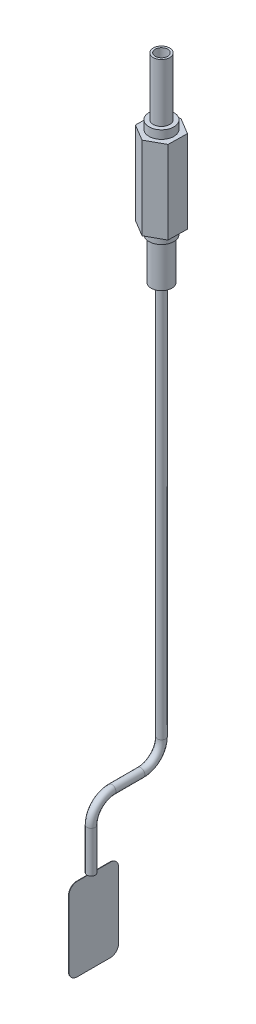
ISO-10303-21;
HEADER;
FILE_DESCRIPTION(('STEP AP214'),'2;1');
FILE_NAME('part.step','',(''),(''),'','','');
FILE_SCHEMA(('AUTOMOTIVE_DESIGN { 1 0 10303 214 1 1 1 1 }'));
ENDSEC;
DATA;
#1=APPLICATION_CONTEXT('core data for automotive mechanical design processes');
#2=APPLICATION_PROTOCOL_DEFINITION('international standard','automotive_design',2000,#1);
#3=PRODUCT_CONTEXT('',#1,'mechanical');
#4=PRODUCT('Part','Part','',(#3));
#5=PRODUCT_RELATED_PRODUCT_CATEGORY('part','',(#4));
#6=PRODUCT_DEFINITION_FORMATION('','',#4);
#7=PRODUCT_DEFINITION_CONTEXT('part definition',#1,'design');
#8=PRODUCT_DEFINITION('design','',#6,#7);
#9=PRODUCT_DEFINITION_SHAPE('','',#8);
#10=(LENGTH_UNIT() NAMED_UNIT(*) SI_UNIT(.MILLI.,.METRE.));
#11=(NAMED_UNIT(*) PLANE_ANGLE_UNIT() SI_UNIT($,.RADIAN.));
#12=(NAMED_UNIT(*) SI_UNIT($,.STERADIAN.) SOLID_ANGLE_UNIT());
#13=UNCERTAINTY_MEASURE_WITH_UNIT(LENGTH_MEASURE(1.E-05),#10,'distance_accuracy_value','');
#14=(GEOMETRIC_REPRESENTATION_CONTEXT(3) GLOBAL_UNCERTAINTY_ASSIGNED_CONTEXT((#13)) GLOBAL_UNIT_ASSIGNED_CONTEXT((#10,
#11,#12)) REPRESENTATION_CONTEXT('',''));
#15=CARTESIAN_POINT('',(0.,0.,0.));
#16=DIRECTION('',(0.,0.,1.));
#17=DIRECTION('',(1.,0.,0.));
#18=AXIS2_PLACEMENT_3D('',#15,#16,#17);
#19=CARTESIAN_POINT('',(0.,-115.,17.));
#20=DIRECTION('',(0.,-1.,0.));
#21=DIRECTION('',(0.,0.,-1.));
#22=AXIS2_PLACEMENT_3D('',#19,#20,#21);
#23=PLANE('',#22);
#24=CARTESIAN_POINT('',(0.,-115.,17.));
#25=DIRECTION('',(0.,-1.,0.));
#26=DIRECTION('',(0.,0.,-1.));
#27=AXIS2_PLACEMENT_3D('',#24,#25,#26);
#28=CIRCLE('',#27,1.);
#29=CARTESIAN_POINT('',(0.,-115.,18.));
#30=VERTEX_POINT('',#29);
#31=CARTESIAN_POINT('',(0.,-115.,16.));
#32=VERTEX_POINT('',#31);
#33=EDGE_CURVE('E205',#30,#32,#28,.T.);
#34=ORIENTED_EDGE('',*,*,#33,.T.);
#35=DIRECTION('',(0.,0.,1.));
#36=VECTOR('',#35,1.);
#37=CARTESIAN_POINT('',(0.,-115.,12.4412442422695));
#38=LINE('',#37,#36);
#39=EDGE_CURVE('E64',#32,#30,#38,.T.);
#40=ORIENTED_EDGE('',*,*,#39,.T.);
#41=EDGE_LOOP('',(#34,#40));
#42=FACE_BOUND('',#41,.T.);
#43=ADVANCED_FACE('F48',(#42),#23,.T.);
#44=CARTESIAN_POINT('',(0.,0.,0.));
#45=DIRECTION('',(0.,1.,0.));
#46=DIRECTION('',(0.,0.,1.));
#47=AXIS2_PLACEMENT_3D('',#44,#45,#46);
#48=PLANE('',#47);
#49=CARTESIAN_POINT('',(0.,0.,0.));
#50=DIRECTION('',(0.,1.,0.));
#51=DIRECTION('',(0.,0.,1.));
#52=AXIS2_PLACEMENT_3D('',#49,#50,#51);
#53=CIRCLE('',#52,2.5);
#54=CARTESIAN_POINT('',(0.,0.,2.5));
#55=VERTEX_POINT('',#54);
#56=EDGE_CURVE('E52',#55,#55,#53,.T.);
#57=ORIENTED_EDGE('',*,*,#56,.F.);
#58=EDGE_LOOP('',(#57));
#59=FACE_BOUND('',#58,.T.);
#60=CARTESIAN_POINT('',(0.,0.,0.));
#61=DIRECTION('',(0.,1.,0.));
#62=DIRECTION('',(0.,0.,1.));
#63=AXIS2_PLACEMENT_3D('',#60,#61,#62);
#64=CIRCLE('',#63,2.);
#65=CARTESIAN_POINT('',(0.,0.,2.));
#66=VERTEX_POINT('',#65);
#67=EDGE_CURVE('E281',#66,#66,#64,.T.);
#68=ORIENTED_EDGE('',*,*,#67,.T.);
#69=EDGE_LOOP('',(#68));
#70=FACE_BOUND('',#69,.T.);
#71=ADVANCED_FACE('F290',(#59,#70),#48,.F.);
#72=CARTESIAN_POINT('',(0.,10.,0.));
#73=DIRECTION('',(0.,-1.,0.));
#74=DIRECTION('',(0.,0.,-1.));
#75=AXIS2_PLACEMENT_3D('',#72,#73,#74);
#76=CYLINDRICAL_SURFACE('',#75,2.5);
#77=CARTESIAN_POINT('',(0.,10.,0.));
#78=DIRECTION('',(0.,1.,0.));
#79=DIRECTION('',(0.,0.,1.));
#80=AXIS2_PLACEMENT_3D('',#77,#78,#79);
#81=CIRCLE('',#80,2.5);
#82=CARTESIAN_POINT('',(0.,10.,2.5));
#83=VERTEX_POINT('',#82);
#84=EDGE_CURVE('E228',#83,#83,#81,.T.);
#85=ORIENTED_EDGE('',*,*,#84,.F.);
#86=EDGE_LOOP('',(#85));
#87=FACE_BOUND('',#86,.T.);
#88=ORIENTED_EDGE('',*,*,#56,.T.);
#89=EDGE_LOOP('',(#88));
#90=FACE_BOUND('',#89,.T.);
#91=ADVANCED_FACE('F50',(#87,#90),#76,.T.);
#92=CARTESIAN_POINT('',(0.,10.,0.));
#93=DIRECTION('',(0.,-1.,0.));
#94=DIRECTION('',(0.,0.,-1.));
#95=AXIS2_PLACEMENT_3D('',#92,#93,#94);
#96=CYLINDRICAL_SURFACE('',#95,2.);
#97=CARTESIAN_POINT('',(0.,10.,0.));
#98=DIRECTION('',(0.,1.,0.));
#99=DIRECTION('',(0.,0.,1.));
#100=AXIS2_PLACEMENT_3D('',#97,#98,#99);
#101=CIRCLE('',#100,2.);
#102=CARTESIAN_POINT('',(0.,10.,2.));
#103=VERTEX_POINT('',#102);
#104=EDGE_CURVE('E276',#103,#103,#101,.T.);
#105=ORIENTED_EDGE('',*,*,#104,.T.);
#106=EDGE_LOOP('',(#105));
#107=FACE_BOUND('',#106,.T.);
#108=ORIENTED_EDGE('',*,*,#67,.F.);
#109=EDGE_LOOP('',(#108));
#110=FACE_BOUND('',#109,.T.);
#111=ADVANCED_FACE('F295',(#107,#110),#96,.F.);
#112=CARTESIAN_POINT('',(0.,10.,0.));
#113=DIRECTION('',(0.,1.,0.));
#114=DIRECTION('',(0.,0.,1.));
#115=AXIS2_PLACEMENT_3D('',#112,#113,#114);
#116=PLANE('',#115);
#117=CARTESIAN_POINT('',(0.,10.,0.));
#118=DIRECTION('',(0.,1.,0.));
#119=DIRECTION('',(0.,0.,1.));
#120=AXIS2_PLACEMENT_3D('',#117,#118,#119);
#121=CIRCLE('',#120,1.);
#122=CARTESIAN_POINT('',(0.,10.,-1.));
#123=VERTEX_POINT('',#122);
#124=EDGE_CURVE('E209',#123,#123,#121,.F.);
#125=ORIENTED_EDGE('',*,*,#124,.F.);
#126=EDGE_LOOP('',(#125));
#127=FACE_BOUND('',#126,.T.);
#128=ORIENTED_EDGE('',*,*,#104,.F.);
#129=EDGE_LOOP('',(#128));
#130=FACE_BOUND('',#129,.T.);
#131=ADVANCED_FACE('F297',(#127,#130),#116,.F.);
#132=CARTESIAN_POINT('',(0.,12.,0.));
#133=DIRECTION('',(0.,-1.,0.));
#134=DIRECTION('',(0.,0.,-1.));
#135=AXIS2_PLACEMENT_3D('',#132,#133,#134);
#136=CYLINDRICAL_SURFACE('',#135,3.);
#137=CARTESIAN_POINT('',(0.,12.,0.));
#138=DIRECTION('',(0.,1.,0.));
#139=DIRECTION('',(0.,0.,1.));
#140=AXIS2_PLACEMENT_3D('',#137,#138,#139);
#141=CIRCLE('',#140,3.);
#142=CARTESIAN_POINT('',(0.,12.,3.));
#143=VERTEX_POINT('',#142);
#144=EDGE_CURVE('E273',#143,#143,#141,.T.);
#145=ORIENTED_EDGE('',*,*,#144,.F.);
#146=EDGE_LOOP('',(#145));
#147=FACE_BOUND('',#146,.T.);
#148=CARTESIAN_POINT('',(0.,10.,0.));
#149=DIRECTION('',(0.,1.,0.));
#150=DIRECTION('',(0.,0.,1.));
#151=AXIS2_PLACEMENT_3D('',#148,#149,#150);
#152=CIRCLE('',#151,3.);
#153=CARTESIAN_POINT('',(0.,10.,3.));
#154=VERTEX_POINT('',#153);
#155=EDGE_CURVE('E272',#154,#154,#152,.T.);
#156=ORIENTED_EDGE('',*,*,#155,.T.);
#157=EDGE_LOOP('',(#156));
#158=FACE_BOUND('',#157,.T.);
#159=ADVANCED_FACE('F304',(#147,#158),#136,.T.);
#160=ORIENTED_EDGE('',*,*,#84,.T.);
#161=EDGE_LOOP('',(#160));
#162=FACE_BOUND('',#161,.T.);
#163=ORIENTED_EDGE('',*,*,#155,.F.);
#164=EDGE_LOOP('',(#163));
#165=FACE_BOUND('',#164,.T.);
#166=ADVANCED_FACE('F307',(#162,#165),#116,.F.);
#167=CARTESIAN_POINT('',(0.0785957676870324,32.,-4.61813339333491));
#168=DIRECTION('',(0.485190898145339,0.,0.87440825268116));
#169=DIRECTION('',(0.87440825268116,0.,-0.485190898145339));
#170=AXIS2_PLACEMENT_3D('',#167,#168,#169);
#171=PLANE('',#170);
#172=DIRECTION('',(-0.87440825268116,0.,0.485190898145339));
#173=VECTOR('',#172,1.);
#174=CARTESIAN_POINT('',(0.0785957676870324,12.,-4.61813339333491));
#175=LINE('',#174,#173);
#176=CARTESIAN_POINT('',(0.0785957676870324,12.,-4.61813339333491));
#177=VERTEX_POINT('',#176);
#178=CARTESIAN_POINT('',(-3.96012295284975,12.,-2.37713262811437));
#179=VERTEX_POINT('',#178);
#180=EDGE_CURVE('E225',#177,#179,#175,.T.);
#181=ORIENTED_EDGE('',*,*,#180,.T.);
#182=DIRECTION('',(0.,-1.,0.));
#183=VECTOR('',#182,1.);
#184=CARTESIAN_POINT('',(-3.96012295284975,32.,-2.37713262811437));
#185=LINE('',#184,#183);
#186=CARTESIAN_POINT('',(-3.96012295284975,32.,-2.37713262811437));
#187=VERTEX_POINT('',#186);
#188=EDGE_CURVE('E269',#187,#179,#185,.T.);
#189=ORIENTED_EDGE('',*,*,#188,.F.);
#190=DIRECTION('',(-0.87440825268116,0.,0.485190898145339));
#191=VECTOR('',#190,1.);
#192=CARTESIAN_POINT('',(0.0785957676870324,32.,-4.61813339333491));
#193=LINE('',#192,#191);
#194=CARTESIAN_POINT('',(0.0785957676870324,32.,-4.61813339333491));
#195=VERTEX_POINT('',#194);
#196=EDGE_CURVE('E229',#195,#187,#193,.T.);
#197=ORIENTED_EDGE('',*,*,#196,.F.);
#198=DIRECTION('',(0.,-1.,0.));
#199=VECTOR('',#198,1.);
#200=CARTESIAN_POINT('',(0.0785957676870324,32.,-4.61813339333491));
#201=LINE('',#200,#199);
#202=EDGE_CURVE('E243',#195,#177,#201,.T.);
#203=ORIENTED_EDGE('',*,*,#202,.T.);
#204=EDGE_LOOP('',(#181,#189,#197,#203));
#205=FACE_BOUND('',#204,.T.);
#206=ADVANCED_FACE('F685',(#205),#171,.F.);
#207=CARTESIAN_POINT('',(-3.96012295284975,32.,-2.37713262811437));
#208=DIRECTION('',(0.999855209173317,0.,0.0170164828617276));
#209=DIRECTION('',(0.0170164828617276,0.,-0.999855209173317));
#210=AXIS2_PLACEMENT_3D('',#207,#208,#209);
#211=PLANE('',#210);
#212=DIRECTION('',(-0.0170164828617276,0.,0.999855209173317));
#213=VECTOR('',#212,1.);
#214=CARTESIAN_POINT('',(-3.96012295284975,12.,-2.37713262811437));
#215=LINE('',#214,#213);
#216=CARTESIAN_POINT('',(-4.03871872053678,12.,2.24100076522054));
#217=VERTEX_POINT('',#216);
#218=EDGE_CURVE('E246',#179,#217,#215,.T.);
#219=ORIENTED_EDGE('',*,*,#218,.T.);
#220=DIRECTION('',(0.,-1.,0.));
#221=VECTOR('',#220,1.);
#222=CARTESIAN_POINT('',(-4.03871872053678,32.,2.24100076522054));
#223=LINE('',#222,#221);
#224=CARTESIAN_POINT('',(-4.03871872053678,32.,2.24100076522054));
#225=VERTEX_POINT('',#224);
#226=EDGE_CURVE('E266',#225,#217,#223,.T.);
#227=ORIENTED_EDGE('',*,*,#226,.F.);
#228=DIRECTION('',(-0.0170164828617276,0.,0.999855209173317));
#229=VECTOR('',#228,1.);
#230=CARTESIAN_POINT('',(-3.96012295284975,32.,-2.37713262811437));
#231=LINE('',#230,#229);
#232=EDGE_CURVE('E232',#187,#225,#231,.T.);
#233=ORIENTED_EDGE('',*,*,#232,.F.);
#234=ORIENTED_EDGE('',*,*,#188,.T.);
#235=EDGE_LOOP('',(#219,#227,#233,#234));
#236=FACE_BOUND('',#235,.T.);
#237=ADVANCED_FACE('F675',(#236),#211,.F.);
#238=CARTESIAN_POINT('',(-4.03871872053678,32.,2.24100076522054));
#239=DIRECTION('',(0.514664311027977,0.,-0.857391769819432));
#240=DIRECTION('',(-0.857391769819432,0.,-0.514664311027977));
#241=AXIS2_PLACEMENT_3D('',#238,#239,#240);
#242=PLANE('',#241);
#243=DIRECTION('',(0.857391769819432,0.,0.514664311027977));
#244=VECTOR('',#243,1.);
#245=CARTESIAN_POINT('',(-4.03871872053678,12.,2.24100076522054));
#246=LINE('',#245,#244);
#247=CARTESIAN_POINT('',(-0.0785957676870293,12.,4.61813339333491));
#248=VERTEX_POINT('',#247);
#249=EDGE_CURVE('E248',#217,#248,#246,.T.);
#250=ORIENTED_EDGE('',*,*,#249,.T.);
#251=DIRECTION('',(0.,-1.,0.));
#252=VECTOR('',#251,1.);
#253=CARTESIAN_POINT('',(-0.0785957676870293,32.,4.61813339333491));
#254=LINE('',#253,#252);
#255=CARTESIAN_POINT('',(-0.0785957676870293,32.,4.61813339333491));
#256=VERTEX_POINT('',#255);
#257=EDGE_CURVE('E263',#256,#248,#254,.T.);
#258=ORIENTED_EDGE('',*,*,#257,.F.);
#259=DIRECTION('',(0.857391769819432,0.,0.514664311027977));
#260=VECTOR('',#259,1.);
#261=CARTESIAN_POINT('',(-4.03871872053678,32.,2.24100076522054));
#262=LINE('',#261,#260);
#263=EDGE_CURVE('E235',#225,#256,#262,.T.);
#264=ORIENTED_EDGE('',*,*,#263,.F.);
#265=ORIENTED_EDGE('',*,*,#226,.T.);
#266=EDGE_LOOP('',(#250,#258,#264,#265));
#267=FACE_BOUND('',#266,.T.);
#268=ADVANCED_FACE('F665',(#267),#242,.F.);
#269=CARTESIAN_POINT('',(-0.0785957676870293,32.,4.61813339333491));
#270=DIRECTION('',(-0.48519089814534,0.,-0.87440825268116));
#271=DIRECTION('',(-0.87440825268116,0.,0.48519089814534));
#272=AXIS2_PLACEMENT_3D('',#269,#270,#271);
#273=PLANE('',#272);
#274=DIRECTION('',(0.87440825268116,0.,-0.48519089814534));
#275=VECTOR('',#274,1.);
#276=CARTESIAN_POINT('',(-0.0785957676870293,12.,4.61813339333491));
#277=LINE('',#276,#275);
#278=CARTESIAN_POINT('',(3.96012295284975,12.,2.37713262811437));
#279=VERTEX_POINT('',#278);
#280=EDGE_CURVE('E250',#248,#279,#277,.T.);
#281=ORIENTED_EDGE('',*,*,#280,.T.);
#282=DIRECTION('',(0.,-1.,0.));
#283=VECTOR('',#282,1.);
#284=CARTESIAN_POINT('',(3.96012295284975,32.,2.37713262811437));
#285=LINE('',#284,#283);
#286=CARTESIAN_POINT('',(3.96012295284975,32.,2.37713262811437));
#287=VERTEX_POINT('',#286);
#288=EDGE_CURVE('E260',#287,#279,#285,.T.);
#289=ORIENTED_EDGE('',*,*,#288,.F.);
#290=DIRECTION('',(0.87440825268116,0.,-0.48519089814534));
#291=VECTOR('',#290,1.);
#292=CARTESIAN_POINT('',(-0.0785957676870293,32.,4.61813339333491));
#293=LINE('',#292,#291);
#294=EDGE_CURVE('E237',#256,#287,#293,.T.);
#295=ORIENTED_EDGE('',*,*,#294,.F.);
#296=ORIENTED_EDGE('',*,*,#257,.T.);
#297=EDGE_LOOP('',(#281,#289,#295,#296));
#298=FACE_BOUND('',#297,.T.);
#299=ADVANCED_FACE('F655',(#298),#273,.F.);
#300=CARTESIAN_POINT('',(3.96012295284975,32.,2.37713262811437));
#301=DIRECTION('',(-0.999855209173316,0.,-0.0170164828617276));
#302=DIRECTION('',(-0.0170164828617276,0.,0.999855209173317));
#303=AXIS2_PLACEMENT_3D('',#300,#301,#302);
#304=PLANE('',#303);
#305=DIRECTION('',(0.0170164828617276,0.,-0.999855209173316));
#306=VECTOR('',#305,1.);
#307=CARTESIAN_POINT('',(3.96012295284975,12.,2.37713262811437));
#308=LINE('',#307,#306);
#309=CARTESIAN_POINT('',(4.03871872053678,12.,-2.24100076522054));
#310=VERTEX_POINT('',#309);
#311=EDGE_CURVE('E252',#279,#310,#308,.T.);
#312=ORIENTED_EDGE('',*,*,#311,.T.);
#313=DIRECTION('',(0.,-1.,0.));
#314=VECTOR('',#313,1.);
#315=CARTESIAN_POINT('',(4.03871872053678,32.,-2.24100076522054));
#316=LINE('',#315,#314);
#317=CARTESIAN_POINT('',(4.03871872053678,32.,-2.24100076522054));
#318=VERTEX_POINT('',#317);
#319=EDGE_CURVE('E257',#318,#310,#316,.T.);
#320=ORIENTED_EDGE('',*,*,#319,.F.);
#321=DIRECTION('',(0.0170164828617276,0.,-0.999855209173316));
#322=VECTOR('',#321,1.);
#323=CARTESIAN_POINT('',(3.96012295284975,32.,2.37713262811437));
#324=LINE('',#323,#322);
#325=EDGE_CURVE('E239',#287,#318,#324,.T.);
#326=ORIENTED_EDGE('',*,*,#325,.F.);
#327=ORIENTED_EDGE('',*,*,#288,.T.);
#328=EDGE_LOOP('',(#312,#320,#326,#327));
#329=FACE_BOUND('',#328,.T.);
#330=ADVANCED_FACE('F645',(#329),#304,.F.);
#331=CARTESIAN_POINT('',(4.03871872053678,32.,-2.24100076522054));
#332=DIRECTION('',(-0.514664311027977,0.,0.857391769819432));
#333=DIRECTION('',(0.857391769819432,0.,0.514664311027977));
#334=AXIS2_PLACEMENT_3D('',#331,#332,#333);
#335=PLANE('',#334);
#336=DIRECTION('',(-0.857391769819432,0.,-0.514664311027977));
#337=VECTOR('',#336,1.);
#338=CARTESIAN_POINT('',(4.03871872053678,12.,-2.24100076522054));
#339=LINE('',#338,#337);
#340=EDGE_CURVE('E233',#310,#177,#339,.T.);
#341=ORIENTED_EDGE('',*,*,#340,.T.);
#342=ORIENTED_EDGE('',*,*,#202,.F.);
#343=DIRECTION('',(-0.857391769819432,0.,-0.514664311027977));
#344=VECTOR('',#343,1.);
#345=CARTESIAN_POINT('',(4.03871872053678,32.,-2.24100076522054));
#346=LINE('',#345,#344);
#347=EDGE_CURVE('E241',#318,#195,#346,.T.);
#348=ORIENTED_EDGE('',*,*,#347,.F.);
#349=ORIENTED_EDGE('',*,*,#319,.T.);
#350=EDGE_LOOP('',(#341,#342,#348,#349));
#351=FACE_BOUND('',#350,.T.);
#352=ADVANCED_FACE('F635',(#351),#335,.F.);
#353=CARTESIAN_POINT('',(0.,32.,0.));
#354=DIRECTION('',(0.,1.,0.));
#355=DIRECTION('',(0.,0.,1.));
#356=AXIS2_PLACEMENT_3D('',#353,#354,#355);
#357=PLANE('',#356);
#358=CARTESIAN_POINT('',(0.,32.,0.));
#359=DIRECTION('',(0.,1.,0.));
#360=DIRECTION('',(0.,0.,1.));
#361=AXIS2_PLACEMENT_3D('',#358,#359,#360);
#362=CIRCLE('',#361,3.);
#363=CARTESIAN_POINT('',(0.,32.,3.));
#364=VERTEX_POINT('',#363);
#365=EDGE_CURVE('E57',#364,#364,#362,.T.);
#366=ORIENTED_EDGE('',*,*,#365,.F.);
#367=EDGE_LOOP('',(#366));
#368=FACE_BOUND('',#367,.T.);
#369=ORIENTED_EDGE('',*,*,#196,.T.);
#370=ORIENTED_EDGE('',*,*,#232,.T.);
#371=ORIENTED_EDGE('',*,*,#263,.T.);
#372=ORIENTED_EDGE('',*,*,#294,.T.);
#373=ORIENTED_EDGE('',*,*,#325,.T.);
#374=ORIENTED_EDGE('',*,*,#347,.T.);
#375=EDGE_LOOP('',(#369,#370,#371,#372,#373,#374));
#376=FACE_BOUND('',#375,.T.);
#377=ADVANCED_FACE('F625',(#368,#376),#357,.T.);
#378=CARTESIAN_POINT('',(0.,12.,0.));
#379=DIRECTION('',(0.,1.,0.));
#380=DIRECTION('',(0.,0.,1.));
#381=AXIS2_PLACEMENT_3D('',#378,#379,#380);
#382=PLANE('',#381);
#383=ORIENTED_EDGE('',*,*,#144,.T.);
#384=EDGE_LOOP('',(#383));
#385=FACE_BOUND('',#384,.T.);
#386=ORIENTED_EDGE('',*,*,#180,.F.);
#387=ORIENTED_EDGE('',*,*,#340,.F.);
#388=ORIENTED_EDGE('',*,*,#311,.F.);
#389=ORIENTED_EDGE('',*,*,#280,.F.);
#390=ORIENTED_EDGE('',*,*,#249,.F.);
#391=ORIENTED_EDGE('',*,*,#218,.F.);
#392=EDGE_LOOP('',(#386,#387,#388,#389,#390,#391));
#393=FACE_BOUND('',#392,.T.);
#394=ADVANCED_FACE('F615',(#385,#393),#382,.F.);
#395=CARTESIAN_POINT('',(0.,34.,0.));
#396=DIRECTION('',(0.,-1.,0.));
#397=DIRECTION('',(0.,0.,-1.));
#398=AXIS2_PLACEMENT_3D('',#395,#396,#397);
#399=CYLINDRICAL_SURFACE('',#398,3.);
#400=CARTESIAN_POINT('',(0.,34.,0.));
#401=DIRECTION('',(0.,1.,0.));
#402=DIRECTION('',(0.,0.,1.));
#403=AXIS2_PLACEMENT_3D('',#400,#401,#402);
#404=CIRCLE('',#403,3.);
#405=CARTESIAN_POINT('',(0.,34.,3.));
#406=VERTEX_POINT('',#405);
#407=EDGE_CURVE('E221',#406,#406,#404,.T.);
#408=ORIENTED_EDGE('',*,*,#407,.F.);
#409=EDGE_LOOP('',(#408));
#410=FACE_BOUND('',#409,.T.);
#411=ORIENTED_EDGE('',*,*,#365,.T.);
#412=EDGE_LOOP('',(#411));
#413=FACE_BOUND('',#412,.T.);
#414=ADVANCED_FACE('F605',(#410,#413),#399,.T.);
#415=CARTESIAN_POINT('',(0.,34.,0.));
#416=DIRECTION('',(0.,1.,0.));
#417=DIRECTION('',(0.,0.,1.));
#418=AXIS2_PLACEMENT_3D('',#415,#416,#417);
#419=PLANE('',#418);
#420=CARTESIAN_POINT('',(0.,34.,0.));
#421=DIRECTION('',(0.,1.,0.));
#422=DIRECTION('',(0.,0.,1.));
#423=AXIS2_PLACEMENT_3D('',#420,#421,#422);
#424=CIRCLE('',#423,2.);
#425=CARTESIAN_POINT('',(0.,34.,2.));
#426=VERTEX_POINT('',#425);
#427=EDGE_CURVE('E12',#426,#426,#424,.T.);
#428=ORIENTED_EDGE('',*,*,#427,.F.);
#429=EDGE_LOOP('',(#428));
#430=FACE_BOUND('',#429,.T.);
#431=ORIENTED_EDGE('',*,*,#407,.T.);
#432=EDGE_LOOP('',(#431));
#433=FACE_BOUND('',#432,.T.);
#434=ADVANCED_FACE('F595',(#430,#433),#419,.T.);
#435=CARTESIAN_POINT('',(0.,48.,0.));
#436=DIRECTION('',(0.,-1.,0.));
#437=DIRECTION('',(0.,0.,-1.));
#438=AXIS2_PLACEMENT_3D('',#435,#436,#437);
#439=CYLINDRICAL_SURFACE('',#438,2.);
#440=CARTESIAN_POINT('',(0.,48.,0.));
#441=DIRECTION('',(0.,1.,0.));
#442=DIRECTION('',(0.,0.,1.));
#443=AXIS2_PLACEMENT_3D('',#440,#441,#442);
#444=CIRCLE('',#443,2.);
#445=CARTESIAN_POINT('',(0.,48.,2.));
#446=VERTEX_POINT('',#445);
#447=EDGE_CURVE('E217',#446,#446,#444,.T.);
#448=ORIENTED_EDGE('',*,*,#447,.F.);
#449=EDGE_LOOP('',(#448));
#450=FACE_BOUND('',#449,.T.);
#451=ORIENTED_EDGE('',*,*,#427,.T.);
#452=EDGE_LOOP('',(#451));
#453=FACE_BOUND('',#452,.T.);
#454=ADVANCED_FACE('F585',(#450,#453),#439,.T.);
#455=CARTESIAN_POINT('',(0.,48.,0.));
#456=DIRECTION('',(0.,1.,0.));
#457=DIRECTION('',(0.,0.,1.));
#458=AXIS2_PLACEMENT_3D('',#455,#456,#457);
#459=PLANE('',#458);
#460=CARTESIAN_POINT('',(0.,48.,0.));
#461=DIRECTION('',(0.,1.,0.));
#462=DIRECTION('',(0.,0.,1.));
#463=AXIS2_PLACEMENT_3D('',#460,#461,#462);
#464=CIRCLE('',#463,1.5);
#465=CARTESIAN_POINT('',(0.,48.,1.5));
#466=VERTEX_POINT('',#465);
#467=EDGE_CURVE('E213',#466,#466,#464,.T.);
#468=ORIENTED_EDGE('',*,*,#467,.F.);
#469=EDGE_LOOP('',(#468));
#470=FACE_BOUND('',#469,.T.);
#471=ORIENTED_EDGE('',*,*,#447,.T.);
#472=EDGE_LOOP('',(#471));
#473=FACE_BOUND('',#472,.T.);
#474=ADVANCED_FACE('F575',(#470,#473),#459,.T.);
#475=CARTESIAN_POINT('',(0.,38.,0.));
#476=DIRECTION('',(0.,1.,0.));
#477=DIRECTION('',(0.,0.,1.));
#478=AXIS2_PLACEMENT_3D('',#475,#476,#477);
#479=CYLINDRICAL_SURFACE('',#478,1.5);
#480=CARTESIAN_POINT('',(0.,38.,0.));
#481=DIRECTION('',(0.,1.,0.));
#482=DIRECTION('',(0.,0.,1.));
#483=AXIS2_PLACEMENT_3D('',#480,#481,#482);
#484=CIRCLE('',#483,1.5);
#485=CARTESIAN_POINT('',(0.,38.,1.5));
#486=VERTEX_POINT('',#485);
#487=EDGE_CURVE('E214',#486,#486,#484,.T.);
#488=ORIENTED_EDGE('',*,*,#487,.F.);
#489=EDGE_LOOP('',(#488));
#490=FACE_BOUND('',#489,.T.);
#491=ORIENTED_EDGE('',*,*,#467,.T.);
#492=EDGE_LOOP('',(#491));
#493=FACE_BOUND('',#492,.T.);
#494=ADVANCED_FACE('F565',(#490,#493),#479,.F.);
#495=CARTESIAN_POINT('',(0.,38.,0.));
#496=DIRECTION('',(0.,1.,0.));
#497=DIRECTION('',(0.,0.,1.));
#498=AXIS2_PLACEMENT_3D('',#495,#496,#497);
#499=PLANE('',#498);
#500=ORIENTED_EDGE('',*,*,#487,.T.);
#501=EDGE_LOOP('',(#500));
#502=FACE_BOUND('',#501,.T.);
#503=ADVANCED_FACE('F329',(#502),#499,.T.);
#504=CARTESIAN_POINT('',(0.,48.002,0.));
#505=DIRECTION('',(0.,-1.,0.));
#506=DIRECTION('',(0.,0.,-1.));
#507=AXIS2_PLACEMENT_3D('',#504,#505,#506);
#508=CYLINDRICAL_SURFACE('',#507,1.);
#509=CARTESIAN_POINT('',(0.,-95.,0.));
#510=DIRECTION('',(0.,-1.,0.));
#511=DIRECTION('',(0.,0.,-1.));
#512=AXIS2_PLACEMENT_3D('',#509,#510,#511);
#513=CIRCLE('',#512,1.);
#514=CARTESIAN_POINT('',(0.,-95.,-1.));
#515=VERTEX_POINT('',#514);
#516=EDGE_CURVE('E188',#515,#515,#513,.T.);
#517=CARTESIAN_POINT('',(0.,10.,-1.));
#518=CARTESIAN_POINT('',(0.,8.90625,-1.));
#519=CARTESIAN_POINT('',(0.,7.8125,-1.));
#520=CARTESIAN_POINT('',(0.,5.625,-1.));
#521=CARTESIAN_POINT('',(0.,4.53125,-1.));
#522=CARTESIAN_POINT('',(0.,2.34375,-1.));
#523=CARTESIAN_POINT('',(0.,1.25,-1.));
#524=CARTESIAN_POINT('',(0.,-0.937499999999996,-1.));
#525=CARTESIAN_POINT('',(0.,-2.03125,-1.));
#526=CARTESIAN_POINT('',(0.,-4.21875,-1.));
#527=CARTESIAN_POINT('',(0.,-5.3125,-1.));
#528=CARTESIAN_POINT('',(0.,-7.5,-1.));
#529=CARTESIAN_POINT('',(0.,-8.59375,-1.));
#530=CARTESIAN_POINT('',(0.,-10.78125,-1.));
#531=CARTESIAN_POINT('',(0.,-11.875,-1.));
#532=CARTESIAN_POINT('',(0.,-14.0625,-1.));
#533=CARTESIAN_POINT('',(0.,-15.15625,-1.));
#534=CARTESIAN_POINT('',(0.,-17.34375,-1.));
#535=CARTESIAN_POINT('',(0.,-18.4375,-1.));
#536=CARTESIAN_POINT('',(0.,-20.625,-1.));
#537=CARTESIAN_POINT('',(0.,-21.71875,-1.));
#538=CARTESIAN_POINT('',(0.,-23.90625,-1.));
#539=CARTESIAN_POINT('',(0.,-25.,-1.));
#540=CARTESIAN_POINT('',(0.,-27.1875,-1.));
#541=CARTESIAN_POINT('',(0.,-28.28125,-1.));
#542=CARTESIAN_POINT('',(0.,-30.46875,-1.));
#543=CARTESIAN_POINT('',(0.,-31.5625,-1.));
#544=CARTESIAN_POINT('',(0.,-33.75,-1.));
#545=CARTESIAN_POINT('',(0.,-34.84375,-1.));
#546=CARTESIAN_POINT('',(0.,-37.03125,-1.));
#547=CARTESIAN_POINT('',(0.,-38.125,-1.));
#548=CARTESIAN_POINT('',(0.,-40.3125,-1.));
#549=CARTESIAN_POINT('',(0.,-41.40625,-1.));
#550=CARTESIAN_POINT('',(0.,-43.59375,-1.));
#551=CARTESIAN_POINT('',(0.,-44.6875,-1.));
#552=CARTESIAN_POINT('',(0.,-46.875,-1.));
#553=CARTESIAN_POINT('',(0.,-47.96875,-1.));
#554=CARTESIAN_POINT('',(0.,-50.15625,-1.));
#555=CARTESIAN_POINT('',(0.,-51.25,-1.));
#556=CARTESIAN_POINT('',(0.,-53.4375,-1.));
#557=CARTESIAN_POINT('',(0.,-54.53125,-1.));
#558=CARTESIAN_POINT('',(0.,-56.71875,-1.));
#559=CARTESIAN_POINT('',(0.,-57.8125,-1.));
#560=CARTESIAN_POINT('',(0.,-60.,-1.));
#561=CARTESIAN_POINT('',(0.,-61.09375,-1.));
#562=CARTESIAN_POINT('',(0.,-63.28125,-1.));
#563=CARTESIAN_POINT('',(0.,-64.375,-1.));
#564=CARTESIAN_POINT('',(0.,-66.5625,-1.));
#565=CARTESIAN_POINT('',(0.,-67.65625,-1.));
#566=CARTESIAN_POINT('',(0.,-69.84375,-1.));
#567=CARTESIAN_POINT('',(0.,-70.9375,-1.));
#568=CARTESIAN_POINT('',(0.,-73.125,-1.));
#569=CARTESIAN_POINT('',(0.,-74.21875,-1.));
#570=CARTESIAN_POINT('',(0.,-76.40625,-1.));
#571=CARTESIAN_POINT('',(0.,-77.5,-1.));
#572=CARTESIAN_POINT('',(0.,-79.6875,-1.));
#573=CARTESIAN_POINT('',(0.,-80.78125,-1.));
#574=CARTESIAN_POINT('',(0.,-82.96875,-1.));
#575=CARTESIAN_POINT('',(0.,-84.0625,-1.));
#576=CARTESIAN_POINT('',(0.,-86.25,-1.));
#577=CARTESIAN_POINT('',(0.,-87.34375,-1.));
#578=CARTESIAN_POINT('',(0.,-89.53125,-1.));
#579=CARTESIAN_POINT('',(0.,-90.625,-1.));
#580=CARTESIAN_POINT('',(0.,-92.8125,-1.));
#581=CARTESIAN_POINT('',(0.,-93.90625,-1.));
#582=CARTESIAN_POINT('',(0.,-95.,-1.));
#583=B_SPLINE_CURVE_WITH_KNOTS('',3,(#517,#518,#519,#520,#521,#522,#523,#524,#525,#526,#527,
#528,#529,#530,#531,#532,#533,#534,#535,#536,#537,#538,#539,#540,#541,#542,#543,#544,#545,#546,
#547,#548,#549,#550,#551,#552,#553,#554,#555,#556,#557,#558,#559,#560,#561,#562,#563,#564,#565,
#566,#567,#568,#569,#570,#571,#572,#573,#574,#575,#576,#577,#578,#579,#580,#581,#582),
.UNSPECIFIED.,.F.,.F.,(4,2,2,2,2,2,2,2,2,2,2,2,2,2,2,2,2,2,2,2,2,2,2,2,2,2,2,2,2,2,2,2,4),(0.,
3.28125,6.5625,9.84375,13.125,16.40625,19.6875,22.96875,26.25,29.53125,32.8125,36.09375,39.375,
42.65625,45.9375,49.21875,52.5,55.78125,59.0625,62.34375,65.625,68.90625,72.1875,75.46875,78.75,
82.03125,85.3125,88.59375,91.875,95.15625,98.4375,101.71875,105.),.UNSPECIFIED.);
#584=EDGE_CURVE('BSEAM319',#123,#515,#583,.T.);
#585=ORIENTED_EDGE('',*,*,#124,.T.);
#586=ORIENTED_EDGE('',*,*,#516,.F.);
#587=ORIENTED_EDGE('',*,*,#584,.T.);
#588=ORIENTED_EDGE('',*,*,#584,.F.);
#589=EDGE_LOOP('',(#585,#587,#586,#588));
#590=FACE_BOUND('',#589,.T.);
#591=ADVANCED_FACE('F319',(#590),#508,.T.);
#592=DIRECTION('',(0.,0.,1.));
#593=VECTOR('',#592,1.);
#594=CARTESIAN_POINT('',(0.1,-115.,12.4412442422695));
#595=LINE('',#594,#593);
#596=CARTESIAN_POINT('',(0.1,-115.,16.0050125628934));
#597=VERTEX_POINT('',#596);
#598=CARTESIAN_POINT('',(0.0999999999999998,-115.,17.9949874371066));
#599=VERTEX_POINT('',#598);
#600=EDGE_CURVE('E365',#597,#599,#595,.T.);
#601=ORIENTED_EDGE('',*,*,#600,.F.);
#602=EDGE_CURVE('E210',#597,#599,#28,.T.);
#603=ORIENTED_EDGE('',*,*,#602,.T.);
#604=EDGE_LOOP('',(#601,#603));
#605=FACE_BOUND('',#604,.T.);
#606=ADVANCED_FACE('F312',(#605),#23,.T.);
#607=CARTESIAN_POINT('',(0.,-95.,4.99999999999999));
#608=DIRECTION('',(-1.,0.,0.));
#609=DIRECTION('',(0.,0.,1.));
#610=AXIS2_PLACEMENT_3D('',#607,#608,#609);
#611=TOROIDAL_SURFACE('',#610,5.,1.);
#612=CARTESIAN_POINT('',(0.,-100.,5.00000000000002));
#613=DIRECTION('',(0.,0.,1.));
#614=DIRECTION('',(0.,-1.,0.));
#615=AXIS2_PLACEMENT_3D('',#612,#613,#614);
#616=CIRCLE('',#615,1.);
#617=CARTESIAN_POINT('',(0.,-101.,5.00000000000003));
#618=VERTEX_POINT('',#617);
#619=EDGE_CURVE('E191',#618,#618,#616,.T.);
#620=CARTESIAN_POINT('',(0.,-95.,4.99999999999999));
#621=DIRECTION('',(-1.,0.,0.));
#622=DIRECTION('',(0.,0.,1.));
#623=AXIS2_PLACEMENT_3D('',#620,#621,#622);
#624=CIRCLE('',#623,6.);
#625=EDGE_CURVE('',#515,#618,#624,.T.);
#626=ORIENTED_EDGE('',*,*,#516,.T.);
#627=ORIENTED_EDGE('',*,*,#619,.F.);
#628=ORIENTED_EDGE('',*,*,#625,.T.);
#629=ORIENTED_EDGE('',*,*,#625,.F.);
#630=EDGE_LOOP('',(#626,#628,#627,#629));
#631=FACE_BOUND('',#630,.T.);
#632=ADVANCED_FACE('F318',(#631),#611,.T.);
#633=CARTESIAN_POINT('',(0.,-100.,5.00000000000002));
#634=DIRECTION('',(0.,0.,1.));
#635=DIRECTION('',(1.,0.,0.));
#636=AXIS2_PLACEMENT_3D('',#633,#634,#635);
#637=CYLINDRICAL_SURFACE('',#636,1.);
#638=CARTESIAN_POINT('',(0.,-100.,12.));
#639=DIRECTION('',(0.,0.,1.));
#640=DIRECTION('',(0.,-1.,0.));
#641=AXIS2_PLACEMENT_3D('',#638,#639,#640);
#642=CIRCLE('',#641,1.);
#643=CARTESIAN_POINT('',(0.,-99.,11.9999999999999));
#644=VERTEX_POINT('',#643);
#645=EDGE_CURVE('E199',#644,#644,#642,.T.);
#646=ORIENTED_EDGE('',*,*,#645,.F.);
#647=EDGE_LOOP('',(#646));
#648=FACE_BOUND('',#647,.T.);
#649=ORIENTED_EDGE('',*,*,#619,.T.);
#650=EDGE_LOOP('',(#649));
#651=FACE_BOUND('',#650,.T.);
#652=ADVANCED_FACE('F326',(#648,#651),#637,.T.);
#653=CARTESIAN_POINT('',(0.,-105.,12.));
#654=DIRECTION('',(1.,0.,0.));
#655=DIRECTION('',(0.,0.,-1.));
#656=AXIS2_PLACEMENT_3D('',#653,#654,#655);
#657=TOROIDAL_SURFACE('',#656,5.,1.);
#658=CARTESIAN_POINT('',(0.,-105.,17.));
#659=DIRECTION('',(0.,-1.,0.));
#660=DIRECTION('',(0.,0.,-1.));
#661=AXIS2_PLACEMENT_3D('',#658,#659,#660);
#662=CIRCLE('',#661,1.);
#663=CARTESIAN_POINT('',(0.,-105.,18.));
#664=VERTEX_POINT('',#663);
#665=EDGE_CURVE('E202',#664,#664,#662,.T.);
#666=CARTESIAN_POINT('',(0.,-105.,12.));
#667=DIRECTION('',(1.,0.,0.));
#668=DIRECTION('',(0.,0.,-1.));
#669=AXIS2_PLACEMENT_3D('',#666,#667,#668);
#670=CIRCLE('',#669,6.);
#671=EDGE_CURVE('',#644,#664,#670,.T.);
#672=ORIENTED_EDGE('',*,*,#645,.T.);
#673=ORIENTED_EDGE('',*,*,#665,.F.);
#674=ORIENTED_EDGE('',*,*,#671,.T.);
#675=ORIENTED_EDGE('',*,*,#671,.F.);
#676=EDGE_LOOP('',(#672,#674,#673,#675));
#677=FACE_BOUND('',#676,.T.);
#678=ADVANCED_FACE('F342',(#677),#657,.T.);
#679=CARTESIAN_POINT('',(0.,-105.,17.));
#680=DIRECTION('',(0.,-1.,0.));
#681=DIRECTION('',(0.,0.,-1.));
#682=AXIS2_PLACEMENT_3D('',#679,#680,#681);
#683=CYLINDRICAL_SURFACE('',#682,1.);
#684=EDGE_CURVE('E206',#32,#597,#28,.T.);
#685=ORIENTED_EDGE('',*,*,#684,.F.);
#686=ORIENTED_EDGE('',*,*,#33,.F.);
#687=EDGE_CURVE('E71',#599,#30,#28,.T.);
#688=ORIENTED_EDGE('',*,*,#687,.F.);
#689=ORIENTED_EDGE('',*,*,#602,.F.);
#690=EDGE_LOOP('',(#685,#686,#688,#689));
#691=FACE_BOUND('',#690,.T.);
#692=ORIENTED_EDGE('',*,*,#665,.T.);
#693=EDGE_LOOP('',(#692));
#694=FACE_BOUND('',#693,.T.);
#695=ADVANCED_FACE('F331',(#691,#694),#683,.T.);
#696=CARTESIAN_POINT('',(0.1,-115.,12.4412442422695));
#697=DIRECTION('',(0.,-1.,0.));
#698=DIRECTION('',(0.,0.,-1.));
#699=AXIS2_PLACEMENT_3D('',#696,#697,#698);
#700=PLANE('',#699);
#701=ORIENTED_EDGE('',*,*,#687,.T.);
#702=CARTESIAN_POINT('',(0.,-115.,20.4412442422695));
#703=VERTEX_POINT('',#702);
#704=EDGE_CURVE('E380',#30,#703,#38,.T.);
#705=ORIENTED_EDGE('',*,*,#704,.T.);
#706=DIRECTION('',(-1.,0.,0.));
#707=VECTOR('',#706,1.);
#708=CARTESIAN_POINT('',(0.1,-115.,20.4412442422695));
#709=LINE('',#708,#707);
#710=CARTESIAN_POINT('',(0.1,-115.,20.4412442422695));
#711=VERTEX_POINT('',#710);
#712=EDGE_CURVE('E378',#711,#703,#709,.T.);
#713=ORIENTED_EDGE('',*,*,#712,.F.);
#714=EDGE_CURVE('E369',#599,#711,#595,.T.);
#715=ORIENTED_EDGE('',*,*,#714,.F.);
#716=EDGE_LOOP('',(#701,#705,#713,#715));
#717=FACE_BOUND('',#716,.T.);
#718=ADVANCED_FACE('F321',(#717),#700,.F.);
#719=CARTESIAN_POINT('',(0.1,-133.,12.4412442422695));
#720=DIRECTION('',(-1.,0.,0.));
#721=DIRECTION('',(0.,0.,1.));
#722=AXIS2_PLACEMENT_3D('',#719,#720,#721);
#723=CYLINDRICAL_SURFACE('',#722,2.);
#724=CARTESIAN_POINT('',(0.,-133.,12.4412442422695));
#725=DIRECTION('',(1.,0.,0.));
#726=DIRECTION('',(0.,0.,-1.));
#727=AXIS2_PLACEMENT_3D('',#724,#725,#726);
#728=CIRCLE('',#727,2.);
#729=CARTESIAN_POINT('',(0.,-135.,12.4412442422695));
#730=VERTEX_POINT('',#729);
#731=CARTESIAN_POINT('',(0.,-133.,10.4412442422695));
#732=VERTEX_POINT('',#731);
#733=EDGE_CURVE('E187',#730,#732,#728,.T.);
#734=ORIENTED_EDGE('',*,*,#733,.T.);
#735=DIRECTION('',(-1.,0.,0.));
#736=VECTOR('',#735,1.);
#737=CARTESIAN_POINT('',(0.1,-133.,10.4412442422695));
#738=LINE('',#737,#736);
#739=CARTESIAN_POINT('',(0.1,-133.,10.4412442422695));
#740=VERTEX_POINT('',#739);
#741=EDGE_CURVE('E167',#740,#732,#738,.T.);
#742=ORIENTED_EDGE('',*,*,#741,.F.);
#743=CARTESIAN_POINT('',(0.1,-133.,12.4412442422695));
#744=DIRECTION('',(1.,0.,0.));
#745=DIRECTION('',(0.,0.,-1.));
#746=AXIS2_PLACEMENT_3D('',#743,#744,#745);
#747=CIRCLE('',#746,2.);
#748=CARTESIAN_POINT('',(0.1,-135.,12.4412442422695));
#749=VERTEX_POINT('',#748);
#750=EDGE_CURVE('E174',#749,#740,#747,.T.);
#751=ORIENTED_EDGE('',*,*,#750,.F.);
#752=DIRECTION('',(-1.,0.,0.));
#753=VECTOR('',#752,1.);
#754=CARTESIAN_POINT('',(0.1,-135.,12.4412442422695));
#755=LINE('',#754,#753);
#756=EDGE_CURVE('E399',#749,#730,#755,.T.);
#757=ORIENTED_EDGE('',*,*,#756,.T.);
#758=EDGE_LOOP('',(#734,#742,#751,#757));
#759=FACE_BOUND('',#758,.T.);
#760=ADVANCED_FACE('F185',(#759),#723,.T.);
#761=CARTESIAN_POINT('',(0.1,-133.,10.4412442422695));
#762=DIRECTION('',(0.,0.,1.));
#763=DIRECTION('',(1.,0.,0.));
#764=AXIS2_PLACEMENT_3D('',#761,#762,#763);
#765=PLANE('',#764);
#766=DIRECTION('',(0.,1.,0.));
#767=VECTOR('',#766,1.);
#768=CARTESIAN_POINT('',(0.,-133.,10.4412442422695));
#769=LINE('',#768,#767);
#770=CARTESIAN_POINT('',(0.,-117.,10.4412442422695));
#771=VERTEX_POINT('',#770);
#772=EDGE_CURVE('E401',#732,#771,#769,.T.);
#773=ORIENTED_EDGE('',*,*,#772,.T.);
#774=DIRECTION('',(-1.,0.,0.));
#775=VECTOR('',#774,1.);
#776=CARTESIAN_POINT('',(0.1,-117.,10.4412442422695));
#777=LINE('',#776,#775);
#778=CARTESIAN_POINT('',(0.1,-117.,10.4412442422695));
#779=VERTEX_POINT('',#778);
#780=EDGE_CURVE('E170',#779,#771,#777,.T.);
#781=ORIENTED_EDGE('',*,*,#780,.F.);
#782=DIRECTION('',(0.,1.,0.));
#783=VECTOR('',#782,1.);
#784=CARTESIAN_POINT('',(0.1,-133.,10.4412442422695));
#785=LINE('',#784,#783);
#786=EDGE_CURVE('E163',#740,#779,#785,.T.);
#787=ORIENTED_EDGE('',*,*,#786,.F.);
#788=ORIENTED_EDGE('',*,*,#741,.T.);
#789=EDGE_LOOP('',(#773,#781,#787,#788));
#790=FACE_BOUND('',#789,.T.);
#791=ADVANCED_FACE('F165',(#790),#765,.F.);
#792=CARTESIAN_POINT('',(0.1,-117.,12.4412442422695));
#793=DIRECTION('',(-1.,0.,0.));
#794=DIRECTION('',(0.,0.,1.));
#795=AXIS2_PLACEMENT_3D('',#792,#793,#794);
#796=CYLINDRICAL_SURFACE('',#795,2.);
#797=CARTESIAN_POINT('',(0.,-117.,12.4412442422695));
#798=DIRECTION('',(1.,0.,0.));
#799=DIRECTION('',(0.,0.,-1.));
#800=AXIS2_PLACEMENT_3D('',#797,#798,#799);
#801=CIRCLE('',#800,2.);
#802=CARTESIAN_POINT('',(0.,-115.,12.4412442422695));
#803=VERTEX_POINT('',#802);
#804=EDGE_CURVE('E403',#771,#803,#801,.T.);
#805=ORIENTED_EDGE('',*,*,#804,.T.);
#806=DIRECTION('',(-1.,0.,0.));
#807=VECTOR('',#806,1.);
#808=CARTESIAN_POINT('',(0.1,-115.,12.4412442422695));
#809=LINE('',#808,#807);
#810=CARTESIAN_POINT('',(0.1,-115.,12.4412442422695));
#811=VERTEX_POINT('',#810);
#812=EDGE_CURVE('E193',#811,#803,#809,.T.);
#813=ORIENTED_EDGE('',*,*,#812,.F.);
#814=CARTESIAN_POINT('',(0.1,-117.,12.4412442422695));
#815=DIRECTION('',(1.,0.,0.));
#816=DIRECTION('',(0.,0.,-1.));
#817=AXIS2_PLACEMENT_3D('',#814,#815,#816);
#818=CIRCLE('',#817,2.);
#819=EDGE_CURVE('E173',#779,#811,#818,.T.);
#820=ORIENTED_EDGE('',*,*,#819,.F.);
#821=ORIENTED_EDGE('',*,*,#780,.T.);
#822=EDGE_LOOP('',(#805,#813,#820,#821));
#823=FACE_BOUND('',#822,.T.);
#824=ADVANCED_FACE('F347',(#823),#796,.T.);
#825=ORIENTED_EDGE('',*,*,#684,.T.);
#826=EDGE_CURVE('E361',#811,#597,#595,.T.);
#827=ORIENTED_EDGE('',*,*,#826,.F.);
#828=ORIENTED_EDGE('',*,*,#812,.T.);
#829=EDGE_CURVE('E363',#803,#32,#38,.T.);
#830=ORIENTED_EDGE('',*,*,#829,.T.);
#831=EDGE_LOOP('',(#825,#827,#828,#830));
#832=FACE_BOUND('',#831,.T.);
#833=ADVANCED_FACE('F336',(#832),#700,.F.);
#834=CARTESIAN_POINT('',(0.1,-117.,20.4412442422695));
#835=DIRECTION('',(-1.,0.,0.));
#836=DIRECTION('',(0.,0.,1.));
#837=AXIS2_PLACEMENT_3D('',#834,#835,#836);
#838=CYLINDRICAL_SURFACE('',#837,2.);
#839=CARTESIAN_POINT('',(0.,-117.,20.4412442422695));
#840=DIRECTION('',(1.,0.,0.));
#841=DIRECTION('',(0.,0.,-1.));
#842=AXIS2_PLACEMENT_3D('',#839,#840,#841);
#843=CIRCLE('',#842,2.);
#844=CARTESIAN_POINT('',(0.,-117.,22.4412442422695));
#845=VERTEX_POINT('',#844);
#846=EDGE_CURVE('E386',#703,#845,#843,.T.);
#847=ORIENTED_EDGE('',*,*,#846,.T.);
#848=DIRECTION('',(-1.,0.,0.));
#849=VECTOR('',#848,1.);
#850=CARTESIAN_POINT('',(0.1,-117.,22.4412442422695));
#851=LINE('',#850,#849);
#852=CARTESIAN_POINT('',(0.1,-117.,22.4412442422695));
#853=VERTEX_POINT('',#852);
#854=EDGE_CURVE('E382',#853,#845,#851,.T.);
#855=ORIENTED_EDGE('',*,*,#854,.F.);
#856=CARTESIAN_POINT('',(0.1,-117.,20.4412442422695));
#857=DIRECTION('',(1.,0.,0.));
#858=DIRECTION('',(0.,0.,-1.));
#859=AXIS2_PLACEMENT_3D('',#856,#857,#858);
#860=CIRCLE('',#859,2.);
#861=EDGE_CURVE('E367',#711,#853,#860,.T.);
#862=ORIENTED_EDGE('',*,*,#861,.F.);
#863=ORIENTED_EDGE('',*,*,#712,.T.);
#864=EDGE_LOOP('',(#847,#855,#862,#863));
#865=FACE_BOUND('',#864,.T.);
#866=ADVANCED_FACE('F346',(#865),#838,.T.);
#867=CARTESIAN_POINT('',(0.1,-117.,22.4412442422695));
#868=DIRECTION('',(0.,0.,-1.));
#869=DIRECTION('',(0.,1.,0.));
#870=AXIS2_PLACEMENT_3D('',#867,#868,#869);
#871=PLANE('',#870);
#872=DIRECTION('',(0.,-1.,0.));
#873=VECTOR('',#872,1.);
#874=CARTESIAN_POINT('',(0.,-117.,22.4412442422695));
#875=LINE('',#874,#873);
#876=CARTESIAN_POINT('',(0.,-133.,22.4412442422695));
#877=VERTEX_POINT('',#876);
#878=EDGE_CURVE('E407',#845,#877,#875,.T.);
#879=ORIENTED_EDGE('',*,*,#878,.T.);
#880=DIRECTION('',(-1.,0.,0.));
#881=VECTOR('',#880,1.);
#882=CARTESIAN_POINT('',(0.1,-133.,22.4412442422695));
#883=LINE('',#882,#881);
#884=CARTESIAN_POINT('',(0.1,-133.,22.4412442422695));
#885=VERTEX_POINT('',#884);
#886=EDGE_CURVE('E389',#885,#877,#883,.T.);
#887=ORIENTED_EDGE('',*,*,#886,.F.);
#888=DIRECTION('',(0.,-1.,0.));
#889=VECTOR('',#888,1.);
#890=CARTESIAN_POINT('',(0.1,-117.,22.4412442422695));
#891=LINE('',#890,#889);
#892=EDGE_CURVE('E370',#853,#885,#891,.T.);
#893=ORIENTED_EDGE('',*,*,#892,.F.);
#894=ORIENTED_EDGE('',*,*,#854,.T.);
#895=EDGE_LOOP('',(#879,#887,#893,#894));
#896=FACE_BOUND('',#895,.T.);
#897=ADVANCED_FACE('F353',(#896),#871,.F.);
#898=CARTESIAN_POINT('',(0.1,-133.,20.4412442422695));
#899=DIRECTION('',(-1.,0.,0.));
#900=DIRECTION('',(0.,0.,1.));
#901=AXIS2_PLACEMENT_3D('',#898,#899,#900);
#902=CYLINDRICAL_SURFACE('',#901,2.);
#903=CARTESIAN_POINT('',(0.,-133.,20.4412442422695));
#904=DIRECTION('',(1.,0.,0.));
#905=DIRECTION('',(0.,0.,1.));
#906=AXIS2_PLACEMENT_3D('',#903,#904,#905);
#907=CIRCLE('',#906,2.);
#908=CARTESIAN_POINT('',(0.,-135.,20.4412442422695));
#909=VERTEX_POINT('',#908);
#910=EDGE_CURVE('E409',#877,#909,#907,.T.);
#911=ORIENTED_EDGE('',*,*,#910,.T.);
#912=DIRECTION('',(-1.,0.,0.));
#913=VECTOR('',#912,1.);
#914=CARTESIAN_POINT('',(0.1,-135.,20.4412442422695));
#915=LINE('',#914,#913);
#916=CARTESIAN_POINT('',(0.1,-135.,20.4412442422695));
#917=VERTEX_POINT('',#916);
#918=EDGE_CURVE('E413',#917,#909,#915,.T.);
#919=ORIENTED_EDGE('',*,*,#918,.F.);
#920=CARTESIAN_POINT('',(0.1,-133.,20.4412442422695));
#921=DIRECTION('',(1.,0.,0.));
#922=DIRECTION('',(0.,0.,1.));
#923=AXIS2_PLACEMENT_3D('',#920,#921,#922);
#924=CIRCLE('',#923,2.);
#925=EDGE_CURVE('E394',#885,#917,#924,.T.);
#926=ORIENTED_EDGE('',*,*,#925,.F.);
#927=ORIENTED_EDGE('',*,*,#886,.T.);
#928=EDGE_LOOP('',(#911,#919,#926,#927));
#929=FACE_BOUND('',#928,.T.);
#930=ADVANCED_FACE('F422',(#929),#902,.T.);
#931=CARTESIAN_POINT('',(0.1,-135.,20.4412442422695));
#932=DIRECTION('',(0.,1.,0.));
#933=DIRECTION('',(0.,0.,1.));
#934=AXIS2_PLACEMENT_3D('',#931,#932,#933);
#935=PLANE('',#934);
#936=DIRECTION('',(0.,0.,-1.));
#937=VECTOR('',#936,1.);
#938=CARTESIAN_POINT('',(0.,-135.,20.4412442422695));
#939=LINE('',#938,#937);
#940=EDGE_CURVE('E183',#909,#730,#939,.T.);
#941=ORIENTED_EDGE('',*,*,#940,.T.);
#942=ORIENTED_EDGE('',*,*,#756,.F.);
#943=DIRECTION('',(0.,0.,-1.));
#944=VECTOR('',#943,1.);
#945=CARTESIAN_POINT('',(0.1,-135.,20.4412442422695));
#946=LINE('',#945,#944);
#947=EDGE_CURVE('E179',#917,#749,#946,.T.);
#948=ORIENTED_EDGE('',*,*,#947,.F.);
#949=ORIENTED_EDGE('',*,*,#918,.T.);
#950=EDGE_LOOP('',(#941,#942,#948,#949));
#951=FACE_BOUND('',#950,.T.);
#952=ADVANCED_FACE('F425',(#951),#935,.F.);
#953=CARTESIAN_POINT('',(0.1,-133.,12.4412442422695));
#954=DIRECTION('',(1.,0.,0.));
#955=DIRECTION('',(0.,0.,-1.));
#956=AXIS2_PLACEMENT_3D('',#953,#954,#955);
#957=PLANE('',#956);
#958=ORIENTED_EDGE('',*,*,#750,.T.);
#959=ORIENTED_EDGE('',*,*,#786,.T.);
#960=ORIENTED_EDGE('',*,*,#819,.T.);
#961=ORIENTED_EDGE('',*,*,#826,.T.);
#962=ORIENTED_EDGE('',*,*,#600,.T.);
#963=ORIENTED_EDGE('',*,*,#714,.T.);
#964=ORIENTED_EDGE('',*,*,#861,.T.);
#965=ORIENTED_EDGE('',*,*,#892,.T.);
#966=ORIENTED_EDGE('',*,*,#925,.T.);
#967=ORIENTED_EDGE('',*,*,#947,.T.);
#968=EDGE_LOOP('',(#958,#959,#960,#961,#962,#963,#964,#965,#966,#967));
#969=FACE_BOUND('',#968,.T.);
#970=ADVANCED_FACE('F177',(#969),#957,.T.);
#971=CARTESIAN_POINT('',(0.,-133.,12.4412442422695));
#972=DIRECTION('',(1.,0.,0.));
#973=DIRECTION('',(0.,0.,-1.));
#974=AXIS2_PLACEMENT_3D('',#971,#972,#973);
#975=PLANE('',#974);
#976=ORIENTED_EDGE('',*,*,#733,.F.);
#977=ORIENTED_EDGE('',*,*,#940,.F.);
#978=ORIENTED_EDGE('',*,*,#910,.F.);
#979=ORIENTED_EDGE('',*,*,#878,.F.);
#980=ORIENTED_EDGE('',*,*,#846,.F.);
#981=ORIENTED_EDGE('',*,*,#704,.F.);
#982=ORIENTED_EDGE('',*,*,#39,.F.);
#983=ORIENTED_EDGE('',*,*,#829,.F.);
#984=ORIENTED_EDGE('',*,*,#804,.F.);
#985=ORIENTED_EDGE('',*,*,#772,.F.);
#986=EDGE_LOOP('',(#976,#977,#978,#979,#980,#981,#982,#983,#984,#985));
#987=FACE_BOUND('',#986,.T.);
#988=ADVANCED_FACE('F418',(#987),#975,.F.);
#989=CLOSED_SHELL('',(#43,#71,#91,#111,#131,#159,#166,#206,#237,#268,#299,#330,#352,#377,#394,
#414,#434,#454,#474,#494,#503,#591,#606,#632,#652,#678,#695,#718,#760,#791,#824,#833,#866,#897,
#930,#952,#970,#988));
#990=MANIFOLD_SOLID_BREP('B2',#989);
#991=ADVANCED_BREP_SHAPE_REPRESENTATION('',(#18,#990),#14);
#992=SHAPE_DEFINITION_REPRESENTATION(#9,#991);
ENDSEC;
END-ISO-10303-21;
